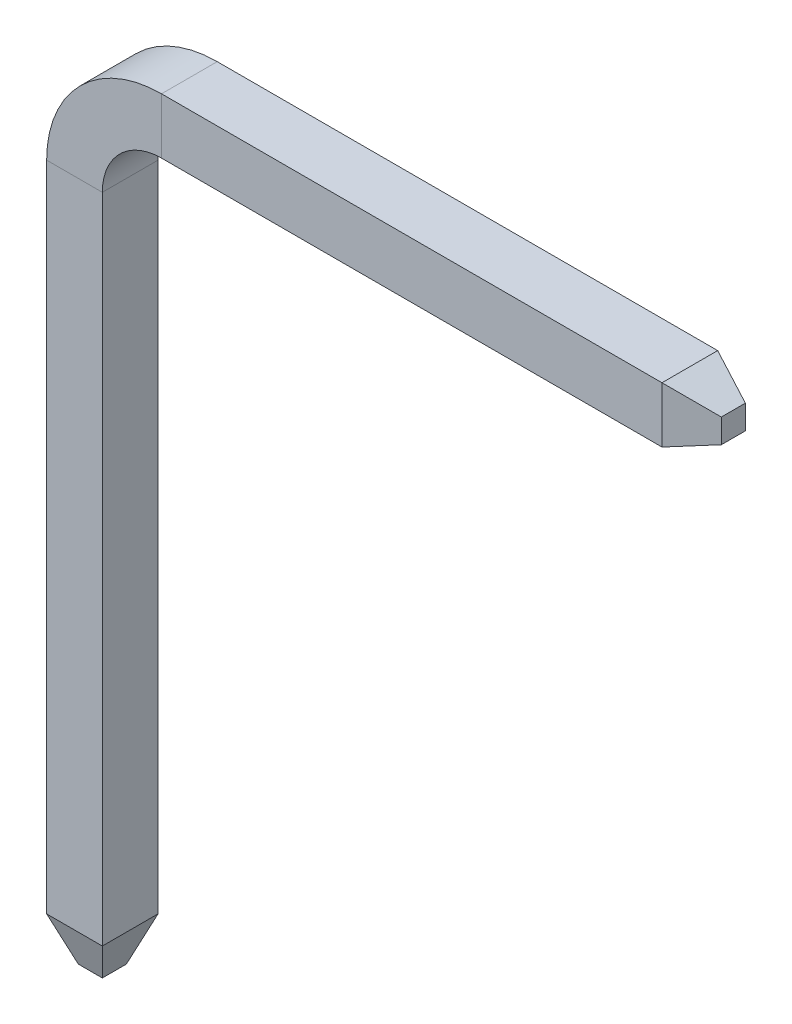
ISO-10303-21;
HEADER;
FILE_DESCRIPTION(('STEP AP214'),'2;1');
FILE_NAME('part.step','',(''),(''),'','','');
FILE_SCHEMA(('AUTOMOTIVE_DESIGN { 1 0 10303 214 1 1 1 1 }'));
ENDSEC;
DATA;
#1=APPLICATION_CONTEXT('core data for automotive mechanical design processes');
#2=APPLICATION_PROTOCOL_DEFINITION('international standard','automotive_design',2000,#1);
#3=PRODUCT_CONTEXT('',#1,'mechanical');
#4=PRODUCT('Part','Part','',(#3));
#5=PRODUCT_RELATED_PRODUCT_CATEGORY('part','',(#4));
#6=PRODUCT_DEFINITION_FORMATION('','',#4);
#7=PRODUCT_DEFINITION_CONTEXT('part definition',#1,'design');
#8=PRODUCT_DEFINITION('design','',#6,#7);
#9=PRODUCT_DEFINITION_SHAPE('','',#8);
#10=(LENGTH_UNIT() NAMED_UNIT(*) SI_UNIT(.MILLI.,.METRE.));
#11=(NAMED_UNIT(*) PLANE_ANGLE_UNIT() SI_UNIT($,.RADIAN.));
#12=(NAMED_UNIT(*) SI_UNIT($,.STERADIAN.) SOLID_ANGLE_UNIT());
#13=UNCERTAINTY_MEASURE_WITH_UNIT(LENGTH_MEASURE(1.E-05),#10,'distance_accuracy_value','');
#14=(GEOMETRIC_REPRESENTATION_CONTEXT(3) GLOBAL_UNCERTAINTY_ASSIGNED_CONTEXT((#13)) GLOBAL_UNIT_ASSIGNED_CONTEXT((#10,
#11,#12)) REPRESENTATION_CONTEXT('',''));
#15=CARTESIAN_POINT('',(0.,0.,0.));
#16=DIRECTION('',(0.,0.,1.));
#17=DIRECTION('',(1.,0.,0.));
#18=AXIS2_PLACEMENT_3D('',#15,#16,#17);
#19=CARTESIAN_POINT('',(0.,-4.25,0.));
#20=DIRECTION('',(0.,1.,0.));
#21=DIRECTION('',(0.,0.,1.));
#22=AXIS2_PLACEMENT_3D('',#19,#20,#21);
#23=PLANE('',#22);
#24=DIRECTION('',(0.,0.,-1.));
#25=VECTOR('',#24,1.);
#26=CARTESIAN_POINT('',(-0.138014882866898,-4.25,-0.32));
#27=LINE('',#26,#25);
#28=CARTESIAN_POINT('',(-0.138014882866898,-4.25,0.138014882866898));
#29=VERTEX_POINT('',#28);
#30=CARTESIAN_POINT('',(-0.138014882866898,-4.25,-0.138014882866898));
#31=VERTEX_POINT('',#30);
#32=EDGE_CURVE('E232',#29,#31,#27,.T.);
#33=ORIENTED_EDGE('',*,*,#32,.T.);
#34=DIRECTION('',(1.,0.,0.));
#35=VECTOR('',#34,1.);
#36=CARTESIAN_POINT('',(0.320000000000001,-4.25,-0.138014882866898));
#37=LINE('',#36,#35);
#38=CARTESIAN_POINT('',(0.138014882866899,-4.25,-0.138014882866898));
#39=VERTEX_POINT('',#38);
#40=EDGE_CURVE('E234',#31,#39,#37,.T.);
#41=ORIENTED_EDGE('',*,*,#40,.T.);
#42=DIRECTION('',(0.,0.,1.));
#43=VECTOR('',#42,1.);
#44=CARTESIAN_POINT('',(0.138014882866899,-4.25,0.32));
#45=LINE('',#44,#43);
#46=CARTESIAN_POINT('',(0.138014882866899,-4.25,0.138014882866898));
#47=VERTEX_POINT('',#46);
#48=EDGE_CURVE('E228',#39,#47,#45,.T.);
#49=ORIENTED_EDGE('',*,*,#48,.T.);
#50=DIRECTION('',(-1.,0.,0.));
#51=VECTOR('',#50,1.);
#52=CARTESIAN_POINT('',(-0.32,-4.25,0.138014882866898));
#53=LINE('',#52,#51);
#54=EDGE_CURVE('E230',#47,#29,#53,.T.);
#55=ORIENTED_EDGE('',*,*,#54,.T.);
#56=EDGE_LOOP('',(#33,#41,#49,#55));
#57=FACE_BOUND('',#56,.T.);
#58=ADVANCED_FACE('F36',(#57),#23,.F.);
#59=CARTESIAN_POINT('',(7.25,4.75,0.));
#60=DIRECTION('',(1.,0.,0.));
#61=DIRECTION('',(0.,0.,1.));
#62=AXIS2_PLACEMENT_3D('',#59,#60,#61);
#63=PLANE('',#62);
#64=DIRECTION('',(0.,0.,1.));
#65=VECTOR('',#64,1.);
#66=CARTESIAN_POINT('',(7.25,4.8880148828669,0.));
#67=LINE('',#66,#65);
#68=CARTESIAN_POINT('',(7.25,4.8880148828669,-0.138014882866898));
#69=VERTEX_POINT('',#68);
#70=CARTESIAN_POINT('',(7.25,4.8880148828669,0.138014882866898));
#71=VERTEX_POINT('',#70);
#72=EDGE_CURVE('E204',#69,#71,#67,.T.);
#73=ORIENTED_EDGE('',*,*,#72,.T.);
#74=DIRECTION('',(0.,-1.,0.));
#75=VECTOR('',#74,1.);
#76=CARTESIAN_POINT('',(7.25,4.75,0.138014882866898));
#77=LINE('',#76,#75);
#78=CARTESIAN_POINT('',(7.25,4.6119851171331,0.138014882866898));
#79=VERTEX_POINT('',#78);
#80=EDGE_CURVE('E206',#71,#79,#77,.T.);
#81=ORIENTED_EDGE('',*,*,#80,.T.);
#82=DIRECTION('',(0.,0.,-1.));
#83=VECTOR('',#82,1.);
#84=CARTESIAN_POINT('',(7.25,4.6119851171331,0.));
#85=LINE('',#84,#83);
#86=CARTESIAN_POINT('',(7.25,4.6119851171331,-0.138014882866898));
#87=VERTEX_POINT('',#86);
#88=EDGE_CURVE('E197',#79,#87,#85,.T.);
#89=ORIENTED_EDGE('',*,*,#88,.T.);
#90=DIRECTION('',(0.,1.,0.));
#91=VECTOR('',#90,1.);
#92=CARTESIAN_POINT('',(7.25,4.75,-0.138014882866898));
#93=LINE('',#92,#91);
#94=EDGE_CURVE('E202',#87,#69,#93,.T.);
#95=ORIENTED_EDGE('',*,*,#94,.T.);
#96=EDGE_LOOP('',(#73,#81,#89,#95));
#97=FACE_BOUND('',#96,.T.);
#98=ADVANCED_FACE('F289',(#97),#63,.T.);
#99=CARTESIAN_POINT('',(-0.32,-4.25,-0.32));
#100=DIRECTION('',(-1.,0.,0.));
#101=DIRECTION('',(0.,-1.,0.));
#102=AXIS2_PLACEMENT_3D('',#99,#100,#101);
#103=PLANE('',#102);
#104=DIRECTION('',(0.,1.,0.));
#105=VECTOR('',#104,1.);
#106=CARTESIAN_POINT('',(-0.32,-4.25,-0.32));
#107=LINE('',#106,#105);
#108=CARTESIAN_POINT('',(-0.32,-3.74999999999999,-0.32));
#109=VERTEX_POINT('',#108);
#110=CARTESIAN_POINT('',(-0.32,3.75,-0.32));
#111=VERTEX_POINT('',#110);
#112=EDGE_CURVE('E127',#109,#111,#107,.T.);
#113=ORIENTED_EDGE('',*,*,#112,.F.);
#114=DIRECTION('',(0.,0.,1.));
#115=VECTOR('',#114,1.);
#116=CARTESIAN_POINT('',(-0.32,-3.74999999999999,0.32));
#117=LINE('',#116,#115);
#118=CARTESIAN_POINT('',(-0.32,-3.74999999999999,0.32));
#119=VERTEX_POINT('',#118);
#120=EDGE_CURVE('E61',#109,#119,#117,.T.);
#121=ORIENTED_EDGE('',*,*,#120,.T.);
#122=DIRECTION('',(0.,1.,0.));
#123=VECTOR('',#122,1.);
#124=CARTESIAN_POINT('',(-0.32,-4.25,0.32));
#125=LINE('',#124,#123);
#126=CARTESIAN_POINT('',(-0.32,3.75,0.32));
#127=VERTEX_POINT('',#126);
#128=EDGE_CURVE('E137',#119,#127,#125,.T.);
#129=ORIENTED_EDGE('',*,*,#128,.T.);
#130=DIRECTION('',(0.,0.,1.));
#131=VECTOR('',#130,1.);
#132=CARTESIAN_POINT('',(-0.32,3.75,-0.32));
#133=LINE('',#132,#131);
#134=EDGE_CURVE('E147',#111,#127,#133,.T.);
#135=ORIENTED_EDGE('',*,*,#134,.F.);
#136=EDGE_LOOP('',(#113,#121,#129,#135));
#137=FACE_BOUND('',#136,.T.);
#138=ADVANCED_FACE('F159',(#137),#103,.T.);
#139=CARTESIAN_POINT('',(-0.32,-4.25,0.32));
#140=DIRECTION('',(0.,0.,1.));
#141=DIRECTION('',(1.,0.,0.));
#142=AXIS2_PLACEMENT_3D('',#139,#140,#141);
#143=PLANE('',#142);
#144=ORIENTED_EDGE('',*,*,#128,.F.);
#145=DIRECTION('',(1.,0.,0.));
#146=VECTOR('',#145,1.);
#147=CARTESIAN_POINT('',(0.320000000000001,-3.74999999999999,0.32));
#148=LINE('',#147,#146);
#149=CARTESIAN_POINT('',(0.320000000000001,-3.74999999999999,0.32));
#150=VERTEX_POINT('',#149);
#151=EDGE_CURVE('E46',#119,#150,#148,.T.);
#152=ORIENTED_EDGE('',*,*,#151,.T.);
#153=DIRECTION('',(0.,1.,0.));
#154=VECTOR('',#153,1.);
#155=CARTESIAN_POINT('',(0.320000000000001,-4.25,0.32));
#156=LINE('',#155,#154);
#157=CARTESIAN_POINT('',(0.32,3.75,0.32));
#158=VERTEX_POINT('',#157);
#159=EDGE_CURVE('E166',#150,#158,#156,.T.);
#160=ORIENTED_EDGE('',*,*,#159,.T.);
#161=DIRECTION('',(1.,0.,0.));
#162=VECTOR('',#161,1.);
#163=CARTESIAN_POINT('',(-0.32,3.75,0.32));
#164=LINE('',#163,#162);
#165=EDGE_CURVE('E161',#127,#158,#164,.T.);
#166=ORIENTED_EDGE('',*,*,#165,.F.);
#167=EDGE_LOOP('',(#144,#152,#160,#166));
#168=FACE_BOUND('',#167,.T.);
#169=ADVANCED_FACE('F360',(#168),#143,.T.);
#170=CARTESIAN_POINT('',(0.320000000000001,-4.25,-0.32));
#171=DIRECTION('',(1.,0.,0.));
#172=DIRECTION('',(0.,1.,0.));
#173=AXIS2_PLACEMENT_3D('',#170,#171,#172);
#174=PLANE('',#173);
#175=ORIENTED_EDGE('',*,*,#159,.F.);
#176=DIRECTION('',(0.,0.,-1.));
#177=VECTOR('',#176,1.);
#178=CARTESIAN_POINT('',(0.32,-3.74999999999999,-0.32));
#179=LINE('',#178,#177);
#180=CARTESIAN_POINT('',(0.32,-3.74999999999999,-0.32));
#181=VERTEX_POINT('',#180);
#182=EDGE_CURVE('E11',#150,#181,#179,.T.);
#183=ORIENTED_EDGE('',*,*,#182,.T.);
#184=DIRECTION('',(0.,1.,0.));
#185=VECTOR('',#184,1.);
#186=CARTESIAN_POINT('',(0.320000000000001,-4.25,-0.32));
#187=LINE('',#186,#185);
#188=CARTESIAN_POINT('',(0.32,3.75,-0.32));
#189=VERTEX_POINT('',#188);
#190=EDGE_CURVE('E162',#181,#189,#187,.T.);
#191=ORIENTED_EDGE('',*,*,#190,.T.);
#192=DIRECTION('',(0.,0.,-1.));
#193=VECTOR('',#192,1.);
#194=CARTESIAN_POINT('',(0.32,3.75,-0.32));
#195=LINE('',#194,#193);
#196=EDGE_CURVE('E157',#158,#189,#195,.T.);
#197=ORIENTED_EDGE('',*,*,#196,.F.);
#198=EDGE_LOOP('',(#175,#183,#191,#197));
#199=FACE_BOUND('',#198,.T.);
#200=ADVANCED_FACE('F363',(#199),#174,.T.);
#201=CARTESIAN_POINT('',(-0.32,-4.25,-0.32));
#202=DIRECTION('',(0.,0.,-1.));
#203=DIRECTION('',(-1.,0.,0.));
#204=AXIS2_PLACEMENT_3D('',#201,#202,#203);
#205=PLANE('',#204);
#206=ORIENTED_EDGE('',*,*,#190,.F.);
#207=DIRECTION('',(-1.,0.,0.));
#208=VECTOR('',#207,1.);
#209=CARTESIAN_POINT('',(-0.32,-3.74999999999999,-0.32));
#210=LINE('',#209,#208);
#211=EDGE_CURVE('E135',#181,#109,#210,.T.);
#212=ORIENTED_EDGE('',*,*,#211,.T.);
#213=ORIENTED_EDGE('',*,*,#112,.T.);
#214=DIRECTION('',(-1.,0.,0.));
#215=VECTOR('',#214,1.);
#216=CARTESIAN_POINT('',(-0.32,3.75,-0.32));
#217=LINE('',#216,#215);
#218=EDGE_CURVE('E132',#189,#111,#217,.T.);
#219=ORIENTED_EDGE('',*,*,#218,.F.);
#220=EDGE_LOOP('',(#206,#212,#213,#219));
#221=FACE_BOUND('',#220,.T.);
#222=ADVANCED_FACE('F130',(#221),#205,.T.);
#223=CARTESIAN_POINT('',(1.,3.75,0.));
#224=DIRECTION('',(0.,0.,-1.));
#225=DIRECTION('',(-1.,0.,0.));
#226=AXIS2_PLACEMENT_3D('',#223,#224,#225);
#227=CYLINDRICAL_SURFACE('',#226,1.32);
#228=CARTESIAN_POINT('',(1.,3.75,0.32));
#229=DIRECTION('',(0.,0.,-1.));
#230=DIRECTION('',(-1.,0.,0.));
#231=AXIS2_PLACEMENT_3D('',#228,#229,#230);
#232=CIRCLE('',#231,1.32);
#233=CARTESIAN_POINT('',(1.,5.07,0.32));
#234=VERTEX_POINT('',#233);
#235=EDGE_CURVE('E171',#127,#234,#232,.T.);
#236=ORIENTED_EDGE('',*,*,#235,.T.);
#237=DIRECTION('',(0.,0.,1.));
#238=VECTOR('',#237,1.);
#239=CARTESIAN_POINT('',(1.,5.07,-0.32));
#240=LINE('',#239,#238);
#241=CARTESIAN_POINT('',(1.,5.07,-0.32));
#242=VERTEX_POINT('',#241);
#243=EDGE_CURVE('E149',#242,#234,#240,.T.);
#244=ORIENTED_EDGE('',*,*,#243,.F.);
#245=CARTESIAN_POINT('',(1.,3.75,-0.32));
#246=DIRECTION('',(0.,0.,-1.));
#247=DIRECTION('',(-1.,0.,0.));
#248=AXIS2_PLACEMENT_3D('',#245,#246,#247);
#249=CIRCLE('',#248,1.32);
#250=EDGE_CURVE('E144',#111,#242,#249,.T.);
#251=ORIENTED_EDGE('',*,*,#250,.F.);
#252=ORIENTED_EDGE('',*,*,#134,.T.);
#253=EDGE_LOOP('',(#236,#244,#251,#252));
#254=FACE_BOUND('',#253,.T.);
#255=ADVANCED_FACE('F146',(#254),#227,.T.);
#256=CARTESIAN_POINT('',(-0.32,3.75,0.32));
#257=DIRECTION('',(0.,0.,1.));
#258=DIRECTION('',(1.,0.,0.));
#259=AXIS2_PLACEMENT_3D('',#256,#257,#258);
#260=PLANE('',#259);
#261=CARTESIAN_POINT('',(1.,3.75,0.32));
#262=DIRECTION('',(0.,0.,-1.));
#263=DIRECTION('',(-1.,0.,0.));
#264=AXIS2_PLACEMENT_3D('',#261,#262,#263);
#265=CIRCLE('',#264,0.68);
#266=CARTESIAN_POINT('',(1.,4.43,0.32));
#267=VERTEX_POINT('',#266);
#268=EDGE_CURVE('E185',#158,#267,#265,.T.);
#269=ORIENTED_EDGE('',*,*,#268,.T.);
#270=DIRECTION('',(0.,-1.,0.));
#271=VECTOR('',#270,1.);
#272=CARTESIAN_POINT('',(1.,5.07,0.32));
#273=LINE('',#272,#271);
#274=EDGE_CURVE('E172',#234,#267,#273,.T.);
#275=ORIENTED_EDGE('',*,*,#274,.F.);
#276=ORIENTED_EDGE('',*,*,#235,.F.);
#277=ORIENTED_EDGE('',*,*,#165,.T.);
#278=EDGE_LOOP('',(#269,#275,#276,#277));
#279=FACE_BOUND('',#278,.T.);
#280=ADVANCED_FACE('F344',(#279),#260,.T.);
#281=CARTESIAN_POINT('',(1.,3.75,0.));
#282=DIRECTION('',(0.,0.,-1.));
#283=DIRECTION('',(-1.,0.,0.));
#284=AXIS2_PLACEMENT_3D('',#281,#282,#283);
#285=CYLINDRICAL_SURFACE('',#284,0.68);
#286=CARTESIAN_POINT('',(1.,3.75,-0.32));
#287=DIRECTION('',(0.,0.,-1.));
#288=DIRECTION('',(-1.,0.,0.));
#289=AXIS2_PLACEMENT_3D('',#286,#287,#288);
#290=CIRCLE('',#289,0.68);
#291=CARTESIAN_POINT('',(1.,4.43,-0.32));
#292=VERTEX_POINT('',#291);
#293=EDGE_CURVE('E156',#189,#292,#290,.T.);
#294=ORIENTED_EDGE('',*,*,#293,.T.);
#295=DIRECTION('',(0.,0.,-1.));
#296=VECTOR('',#295,1.);
#297=CARTESIAN_POINT('',(1.,4.43,-0.32));
#298=LINE('',#297,#296);
#299=EDGE_CURVE('E188',#267,#292,#298,.T.);
#300=ORIENTED_EDGE('',*,*,#299,.F.);
#301=ORIENTED_EDGE('',*,*,#268,.F.);
#302=ORIENTED_EDGE('',*,*,#196,.T.);
#303=EDGE_LOOP('',(#294,#300,#301,#302));
#304=FACE_BOUND('',#303,.T.);
#305=ADVANCED_FACE('F340',(#304),#285,.F.);
#306=CARTESIAN_POINT('',(-0.32,3.75,-0.32));
#307=DIRECTION('',(0.,0.,-1.));
#308=DIRECTION('',(-1.,0.,0.));
#309=AXIS2_PLACEMENT_3D('',#306,#307,#308);
#310=PLANE('',#309);
#311=DIRECTION('',(0.,1.,0.));
#312=VECTOR('',#311,1.);
#313=CARTESIAN_POINT('',(1.,5.07,-0.32));
#314=LINE('',#313,#312);
#315=EDGE_CURVE('E180',#292,#242,#314,.T.);
#316=ORIENTED_EDGE('',*,*,#315,.F.);
#317=ORIENTED_EDGE('',*,*,#293,.F.);
#318=ORIENTED_EDGE('',*,*,#218,.T.);
#319=ORIENTED_EDGE('',*,*,#250,.T.);
#320=EDGE_LOOP('',(#316,#317,#318,#319));
#321=FACE_BOUND('',#320,.T.);
#322=ADVANCED_FACE('F154',(#321),#310,.T.);
#323=CARTESIAN_POINT('',(1.,5.07,-0.32));
#324=DIRECTION('',(0.,1.,0.));
#325=DIRECTION('',(0.,0.,1.));
#326=AXIS2_PLACEMENT_3D('',#323,#324,#325);
#327=PLANE('',#326);
#328=DIRECTION('',(1.,0.,0.));
#329=VECTOR('',#328,1.);
#330=CARTESIAN_POINT('',(1.,5.07,0.32));
#331=LINE('',#330,#329);
#332=CARTESIAN_POINT('',(6.74999999999999,5.07,0.32));
#333=VERTEX_POINT('',#332);
#334=EDGE_CURVE('E174',#234,#333,#331,.T.);
#335=ORIENTED_EDGE('',*,*,#334,.T.);
#336=DIRECTION('',(0.,0.,-1.));
#337=VECTOR('',#336,1.);
#338=CARTESIAN_POINT('',(6.74999999999999,5.07,-0.32));
#339=LINE('',#338,#337);
#340=CARTESIAN_POINT('',(6.74999999999999,5.07,-0.32));
#341=VERTEX_POINT('',#340);
#342=EDGE_CURVE('E212',#333,#341,#339,.T.);
#343=ORIENTED_EDGE('',*,*,#342,.T.);
#344=DIRECTION('',(1.,0.,0.));
#345=VECTOR('',#344,1.);
#346=CARTESIAN_POINT('',(1.,5.07,-0.32));
#347=LINE('',#346,#345);
#348=EDGE_CURVE('E178',#242,#341,#347,.T.);
#349=ORIENTED_EDGE('',*,*,#348,.F.);
#350=ORIENTED_EDGE('',*,*,#243,.T.);
#351=EDGE_LOOP('',(#335,#343,#349,#350));
#352=FACE_BOUND('',#351,.T.);
#353=ADVANCED_FACE('F349',(#352),#327,.T.);
#354=CARTESIAN_POINT('',(1.,5.07,0.32));
#355=DIRECTION('',(0.,0.,1.));
#356=DIRECTION('',(1.,0.,0.));
#357=AXIS2_PLACEMENT_3D('',#354,#355,#356);
#358=PLANE('',#357);
#359=DIRECTION('',(1.,0.,0.));
#360=VECTOR('',#359,1.);
#361=CARTESIAN_POINT('',(1.,4.43,0.32));
#362=LINE('',#361,#360);
#363=CARTESIAN_POINT('',(6.74999999999999,4.43,0.32));
#364=VERTEX_POINT('',#363);
#365=EDGE_CURVE('E177',#267,#364,#362,.T.);
#366=ORIENTED_EDGE('',*,*,#365,.T.);
#367=DIRECTION('',(0.,1.,0.));
#368=VECTOR('',#367,1.);
#369=CARTESIAN_POINT('',(6.74999999999999,5.07,0.32));
#370=LINE('',#369,#368);
#371=EDGE_CURVE('E209',#364,#333,#370,.T.);
#372=ORIENTED_EDGE('',*,*,#371,.T.);
#373=ORIENTED_EDGE('',*,*,#334,.F.);
#374=ORIENTED_EDGE('',*,*,#274,.T.);
#375=EDGE_LOOP('',(#366,#372,#373,#374));
#376=FACE_BOUND('',#375,.T.);
#377=ADVANCED_FACE('F283',(#376),#358,.T.);
#378=CARTESIAN_POINT('',(1.,4.43,-0.32));
#379=DIRECTION('',(0.,-1.,0.));
#380=DIRECTION('',(0.,0.,-1.));
#381=AXIS2_PLACEMENT_3D('',#378,#379,#380);
#382=PLANE('',#381);
#383=DIRECTION('',(1.,0.,0.));
#384=VECTOR('',#383,1.);
#385=CARTESIAN_POINT('',(1.,4.43,-0.32));
#386=LINE('',#385,#384);
#387=CARTESIAN_POINT('',(6.74999999999999,4.43,-0.32));
#388=VERTEX_POINT('',#387);
#389=EDGE_CURVE('E191',#292,#388,#386,.T.);
#390=ORIENTED_EDGE('',*,*,#389,.T.);
#391=DIRECTION('',(0.,0.,1.));
#392=VECTOR('',#391,1.);
#393=CARTESIAN_POINT('',(6.74999999999999,4.43,-0.32));
#394=LINE('',#393,#392);
#395=EDGE_CURVE('E216',#388,#364,#394,.T.);
#396=ORIENTED_EDGE('',*,*,#395,.T.);
#397=ORIENTED_EDGE('',*,*,#365,.F.);
#398=ORIENTED_EDGE('',*,*,#299,.T.);
#399=EDGE_LOOP('',(#390,#396,#397,#398));
#400=FACE_BOUND('',#399,.T.);
#401=ADVANCED_FACE('F273',(#400),#382,.T.);
#402=CARTESIAN_POINT('',(1.,5.07,-0.32));
#403=DIRECTION('',(0.,0.,-1.));
#404=DIRECTION('',(-1.,0.,0.));
#405=AXIS2_PLACEMENT_3D('',#402,#403,#404);
#406=PLANE('',#405);
#407=ORIENTED_EDGE('',*,*,#348,.T.);
#408=DIRECTION('',(0.,-1.,0.));
#409=VECTOR('',#408,1.);
#410=CARTESIAN_POINT('',(6.74999999999999,5.07,-0.32));
#411=LINE('',#410,#409);
#412=EDGE_CURVE('E214',#341,#388,#411,.T.);
#413=ORIENTED_EDGE('',*,*,#412,.T.);
#414=ORIENTED_EDGE('',*,*,#389,.F.);
#415=ORIENTED_EDGE('',*,*,#315,.T.);
#416=EDGE_LOOP('',(#407,#413,#414,#415));
#417=FACE_BOUND('',#416,.T.);
#418=ADVANCED_FACE('F270',(#417),#406,.T.);
#419=CARTESIAN_POINT('',(7.25,4.75,-0.138014882866898));
#420=DIRECTION('',(-0.342020143325666,0.,0.939692620785909));
#421=DIRECTION('',(0.,1.,0.));
#422=AXIS2_PLACEMENT_3D('',#419,#420,#421);
#423=PLANE('',#422);
#424=DIRECTION('',(0.88912649071599,0.323615577118183,0.323615577118183));
#425=VECTOR('',#424,1.);
#426=CARTESIAN_POINT('',(7.28971173749895,4.62643900753371,-0.123560992466287));
#427=LINE('',#426,#425);
#428=EDGE_CURVE('E222',#388,#87,#427,.T.);
#429=ORIENTED_EDGE('',*,*,#428,.F.);
#430=ORIENTED_EDGE('',*,*,#412,.F.);
#431=DIRECTION('',(0.88912649071599,-0.323615577118183,0.323615577118183));
#432=VECTOR('',#431,1.);
#433=CARTESIAN_POINT('',(7.28971173749895,4.87356099246629,-0.123560992466287));
#434=LINE('',#433,#432);
#435=EDGE_CURVE('E138',#69,#341,#434,.F.);
#436=ORIENTED_EDGE('',*,*,#435,.F.);
#437=ORIENTED_EDGE('',*,*,#94,.F.);
#438=EDGE_LOOP('',(#429,#430,#436,#437));
#439=FACE_BOUND('',#438,.T.);
#440=ADVANCED_FACE('F272',(#439),#423,.F.);
#441=CARTESIAN_POINT('',(7.25,4.8880148828669,0.));
#442=DIRECTION('',(-0.342020143325666,-0.939692620785909,0.));
#443=DIRECTION('',(0.,0.,1.));
#444=AXIS2_PLACEMENT_3D('',#441,#442,#443);
#445=PLANE('',#444);
#446=ORIENTED_EDGE('',*,*,#435,.T.);
#447=ORIENTED_EDGE('',*,*,#342,.F.);
#448=DIRECTION('',(0.88912649071599,-0.323615577118183,-0.323615577118183));
#449=VECTOR('',#448,1.);
#450=CARTESIAN_POINT('',(7.28971173749895,4.87356099246629,0.123560992466287));
#451=LINE('',#450,#449);
#452=EDGE_CURVE('E220',#71,#333,#451,.F.);
#453=ORIENTED_EDGE('',*,*,#452,.F.);
#454=ORIENTED_EDGE('',*,*,#72,.F.);
#455=EDGE_LOOP('',(#446,#447,#453,#454));
#456=FACE_BOUND('',#455,.T.);
#457=ADVANCED_FACE('F280',(#456),#445,.F.);
#458=CARTESIAN_POINT('',(7.25,4.6119851171331,0.));
#459=DIRECTION('',(-0.342020143325666,0.939692620785909,0.));
#460=DIRECTION('',(0.,0.,-1.));
#461=AXIS2_PLACEMENT_3D('',#458,#459,#460);
#462=PLANE('',#461);
#463=ORIENTED_EDGE('',*,*,#428,.T.);
#464=ORIENTED_EDGE('',*,*,#88,.F.);
#465=DIRECTION('',(-0.88912649071599,-0.323615577118183,0.323615577118183));
#466=VECTOR('',#465,1.);
#467=CARTESIAN_POINT('',(7.28971173749895,4.62643900753371,0.123560992466287));
#468=LINE('',#467,#466);
#469=EDGE_CURVE('E218',#364,#79,#468,.F.);
#470=ORIENTED_EDGE('',*,*,#469,.F.);
#471=ORIENTED_EDGE('',*,*,#395,.F.);
#472=EDGE_LOOP('',(#463,#464,#470,#471));
#473=FACE_BOUND('',#472,.T.);
#474=ADVANCED_FACE('F302',(#473),#462,.F.);
#475=CARTESIAN_POINT('',(7.25,4.75,0.138014882866898));
#476=DIRECTION('',(-0.342020143325666,0.,-0.939692620785909));
#477=DIRECTION('',(0.,-1.,0.));
#478=AXIS2_PLACEMENT_3D('',#475,#476,#477);
#479=PLANE('',#478);
#480=ORIENTED_EDGE('',*,*,#452,.T.);
#481=ORIENTED_EDGE('',*,*,#371,.F.);
#482=ORIENTED_EDGE('',*,*,#469,.T.);
#483=ORIENTED_EDGE('',*,*,#80,.F.);
#484=EDGE_LOOP('',(#480,#481,#482,#483));
#485=FACE_BOUND('',#484,.T.);
#486=ADVANCED_FACE('F296',(#485),#479,.F.);
#487=CARTESIAN_POINT('',(-0.32,-3.74999999999999,0.32));
#488=DIRECTION('',(0.,-0.342020143325666,0.939692620785909));
#489=DIRECTION('',(-1.,0.,0.));
#490=AXIS2_PLACEMENT_3D('',#487,#488,#489);
#491=PLANE('',#490);
#492=DIRECTION('',(0.323615577118183,-0.88912649071599,-0.323615577118183));
#493=VECTOR('',#492,1.);
#494=CARTESIAN_POINT('',(-0.32,-3.74999999999999,0.32));
#495=LINE('',#494,#493);
#496=EDGE_CURVE('E242',#29,#119,#495,.F.);
#497=ORIENTED_EDGE('',*,*,#496,.F.);
#498=ORIENTED_EDGE('',*,*,#54,.F.);
#499=DIRECTION('',(-0.323615577118183,-0.88912649071599,-0.323615577118183));
#500=VECTOR('',#499,1.);
#501=CARTESIAN_POINT('',(0.252974693277738,-3.93415051675143,0.252974693277738));
#502=LINE('',#501,#500);
#503=EDGE_CURVE('E41',#150,#47,#502,.T.);
#504=ORIENTED_EDGE('',*,*,#503,.F.);
#505=ORIENTED_EDGE('',*,*,#151,.F.);
#506=EDGE_LOOP('',(#497,#498,#504,#505));
#507=FACE_BOUND('',#506,.T.);
#508=ADVANCED_FACE('F39',(#507),#491,.T.);
#509=CARTESIAN_POINT('',(0.32,-3.74999999999999,-0.32));
#510=DIRECTION('',(0.939692620785909,-0.342020143325666,0.));
#511=DIRECTION('',(0.,0.,1.));
#512=AXIS2_PLACEMENT_3D('',#509,#510,#511);
#513=PLANE('',#512);
#514=ORIENTED_EDGE('',*,*,#503,.T.);
#515=ORIENTED_EDGE('',*,*,#48,.F.);
#516=DIRECTION('',(0.323615577118183,0.88912649071599,-0.323615577118183));
#517=VECTOR('',#516,1.);
#518=CARTESIAN_POINT('',(0.32,-3.74999999999999,-0.32));
#519=LINE('',#518,#517);
#520=EDGE_CURVE('E241',#181,#39,#519,.F.);
#521=ORIENTED_EDGE('',*,*,#520,.F.);
#522=ORIENTED_EDGE('',*,*,#182,.F.);
#523=EDGE_LOOP('',(#514,#515,#521,#522));
#524=FACE_BOUND('',#523,.T.);
#525=ADVANCED_FACE('F252',(#524),#513,.T.);
#526=CARTESIAN_POINT('',(-0.32,-3.74999999999999,-0.32));
#527=DIRECTION('',(-0.939692620785909,-0.342020143325666,0.));
#528=DIRECTION('',(0.,0.,-1.));
#529=AXIS2_PLACEMENT_3D('',#526,#527,#528);
#530=PLANE('',#529);
#531=ORIENTED_EDGE('',*,*,#496,.T.);
#532=ORIENTED_EDGE('',*,*,#120,.F.);
#533=DIRECTION('',(0.323615577118183,-0.88912649071599,0.323615577118183));
#534=VECTOR('',#533,1.);
#535=CARTESIAN_POINT('',(-0.32,-3.74999999999999,-0.32));
#536=LINE('',#535,#534);
#537=EDGE_CURVE('E239',#31,#109,#536,.F.);
#538=ORIENTED_EDGE('',*,*,#537,.F.);
#539=ORIENTED_EDGE('',*,*,#32,.F.);
#540=EDGE_LOOP('',(#531,#532,#538,#539));
#541=FACE_BOUND('',#540,.T.);
#542=ADVANCED_FACE('F261',(#541),#530,.T.);
#543=CARTESIAN_POINT('',(-0.32,-3.74999999999999,-0.32));
#544=DIRECTION('',(0.,-0.342020143325666,-0.939692620785909));
#545=DIRECTION('',(1.,0.,0.));
#546=AXIS2_PLACEMENT_3D('',#543,#544,#545);
#547=PLANE('',#546);
#548=ORIENTED_EDGE('',*,*,#520,.T.);
#549=ORIENTED_EDGE('',*,*,#40,.F.);
#550=ORIENTED_EDGE('',*,*,#537,.T.);
#551=ORIENTED_EDGE('',*,*,#211,.F.);
#552=EDGE_LOOP('',(#548,#549,#550,#551));
#553=FACE_BOUND('',#552,.T.);
#554=ADVANCED_FACE('F260',(#553),#547,.T.);
#555=CLOSED_SHELL('',(#58,#98,#138,#169,#200,#222,#255,#280,#305,#322,#353,#377,#401,#418,#440,
#457,#474,#486,#508,#525,#542,#554));
#556=MANIFOLD_SOLID_BREP('B2',#555);
#557=ADVANCED_BREP_SHAPE_REPRESENTATION('',(#18,#556),#14);
#558=SHAPE_DEFINITION_REPRESENTATION(#9,#557);
ENDSEC;
END-ISO-10303-21;
